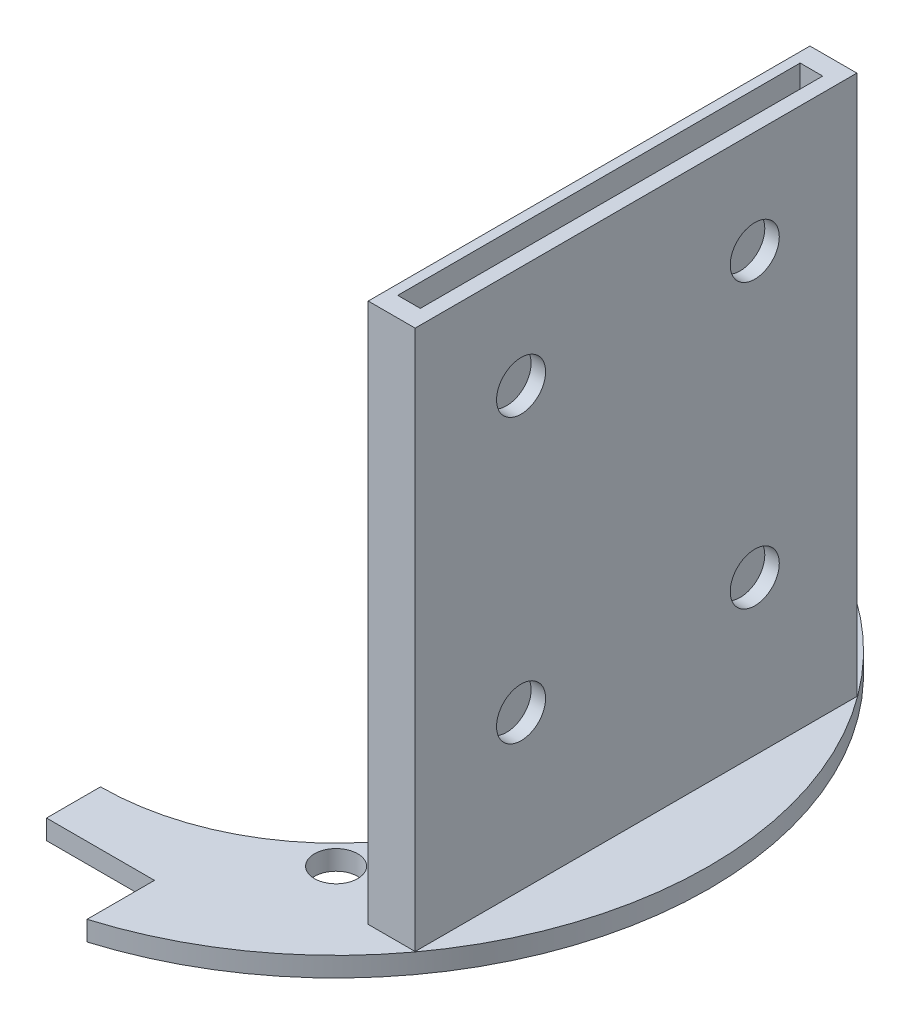
ISO-10303-21;
HEADER;
FILE_DESCRIPTION(('STEP AP214'),'2;1');
FILE_NAME('part.step','',(''),(''),'','','');
FILE_SCHEMA(('AUTOMOTIVE_DESIGN { 1 0 10303 214 1 1 1 1 }'));
ENDSEC;
DATA;
#1=APPLICATION_CONTEXT('core data for automotive mechanical design processes');
#2=APPLICATION_PROTOCOL_DEFINITION('international standard','automotive_design',2000,#1);
#3=PRODUCT_CONTEXT('',#1,'mechanical');
#4=PRODUCT('Part','Part','',(#3));
#5=PRODUCT_RELATED_PRODUCT_CATEGORY('part','',(#4));
#6=PRODUCT_DEFINITION_FORMATION('','',#4);
#7=PRODUCT_DEFINITION_CONTEXT('part definition',#1,'design');
#8=PRODUCT_DEFINITION('design','',#6,#7);
#9=PRODUCT_DEFINITION_SHAPE('','',#8);
#10=(LENGTH_UNIT() NAMED_UNIT(*) SI_UNIT(.MILLI.,.METRE.));
#11=(NAMED_UNIT(*) PLANE_ANGLE_UNIT() SI_UNIT($,.RADIAN.));
#12=(NAMED_UNIT(*) SI_UNIT($,.STERADIAN.) SOLID_ANGLE_UNIT());
#13=UNCERTAINTY_MEASURE_WITH_UNIT(LENGTH_MEASURE(1.E-05),#10,'distance_accuracy_value','');
#14=(GEOMETRIC_REPRESENTATION_CONTEXT(3) GLOBAL_UNCERTAINTY_ASSIGNED_CONTEXT((#13)) GLOBAL_UNIT_ASSIGNED_CONTEXT((#10,
#11,#12)) REPRESENTATION_CONTEXT('',''));
#15=CARTESIAN_POINT('',(0.,0.,0.));
#16=DIRECTION('',(0.,0.,1.));
#17=DIRECTION('',(1.,0.,0.));
#18=AXIS2_PLACEMENT_3D('',#15,#16,#17);
#19=CARTESIAN_POINT('',(3.,2.,0.));
#20=DIRECTION('',(0.,1.,0.));
#21=DIRECTION('',(0.,0.,1.));
#22=AXIS2_PLACEMENT_3D('',#19,#20,#21);
#23=PLANE('',#22);
#24=DIRECTION('',(0.,0.,-1.));
#25=VECTOR('',#24,1.);
#26=CARTESIAN_POINT('',(61.4999999999999,2.,-29.5));
#27=LINE('',#26,#25);
#28=CARTESIAN_POINT('',(61.4999999999999,2.,29.5));
#29=VERTEX_POINT('',#28);
#30=CARTESIAN_POINT('',(61.4999999999999,2.,24.));
#31=VERTEX_POINT('',#30);
#32=EDGE_CURVE('E234',#29,#31,#27,.T.);
#33=ORIENTED_EDGE('',*,*,#32,.F.);
#34=DIRECTION('',(-1.,0.,0.));
#35=VECTOR('',#34,1.);
#36=CARTESIAN_POINT('',(50.5,2.,29.5));
#37=LINE('',#36,#35);
#38=CARTESIAN_POINT('',(72.5,2.,29.5));
#39=VERTEX_POINT('',#38);
#40=EDGE_CURVE('E292',#39,#29,#37,.T.);
#41=ORIENTED_EDGE('',*,*,#40,.F.);
#42=DIRECTION('',(0.,0.,-1.));
#43=VECTOR('',#42,1.);
#44=CARTESIAN_POINT('',(72.5,2.,29.5));
#45=LINE('',#44,#43);
#46=CARTESIAN_POINT('',(72.5,2.,36.3730669589464));
#47=VERTEX_POINT('',#46);
#48=EDGE_CURVE('E255',#47,#39,#45,.T.);
#49=ORIENTED_EDGE('',*,*,#48,.F.);
#50=CARTESIAN_POINT('',(61.5,2.,0.));
#51=DIRECTION('',(0.,1.,0.));
#52=DIRECTION('',(0.,0.,1.));
#53=AXIS2_PLACEMENT_3D('',#50,#51,#52);
#54=CIRCLE('',#53,38.);
#55=CARTESIAN_POINT('',(72.5,2.,-36.3730669589464));
#56=VERTEX_POINT('',#55);
#57=EDGE_CURVE('E252',#47,#56,#54,.T.);
#58=ORIENTED_EDGE('',*,*,#57,.T.);
#59=DIRECTION('',(0.,0.,-1.));
#60=VECTOR('',#59,1.);
#61=CARTESIAN_POINT('',(72.5,2.,-38.));
#62=LINE('',#61,#60);
#63=CARTESIAN_POINT('',(72.5,2.,-29.5));
#64=VERTEX_POINT('',#63);
#65=EDGE_CURVE('E283',#64,#56,#62,.T.);
#66=ORIENTED_EDGE('',*,*,#65,.F.);
#67=DIRECTION('',(1.,0.,0.));
#68=VECTOR('',#67,1.);
#69=CARTESIAN_POINT('',(50.4999999999999,2.,-29.5));
#70=LINE('',#69,#68);
#71=CARTESIAN_POINT('',(61.4999999999999,2.,-29.5));
#72=VERTEX_POINT('',#71);
#73=EDGE_CURVE('E273',#72,#64,#70,.T.);
#74=ORIENTED_EDGE('',*,*,#73,.F.);
#75=CARTESIAN_POINT('',(61.4999999999999,2.,-24.));
#76=VERTEX_POINT('',#75);
#77=EDGE_CURVE('E232',#76,#72,#27,.T.);
#78=ORIENTED_EDGE('',*,*,#77,.F.);
#79=CARTESIAN_POINT('',(61.5,2.,0.));
#80=DIRECTION('',(0.,1.,0.));
#81=DIRECTION('',(0.,0.,1.));
#82=AXIS2_PLACEMENT_3D('',#79,#80,#81);
#83=CIRCLE('',#82,24.);
#84=EDGE_CURVE('E263',#31,#76,#83,.T.);
#85=ORIENTED_EDGE('',*,*,#84,.F.);
#86=EDGE_LOOP('',(#33,#41,#49,#58,#66,#74,#78,#85));
#87=FACE_BOUND('',#86,.T.);
#88=CARTESIAN_POINT('',(80.5,2.,-19.));
#89=DIRECTION('',(0.,1.,0.));
#90=DIRECTION('',(0.,0.,1.));
#91=AXIS2_PLACEMENT_3D('',#88,#89,#90);
#92=CIRCLE('',#91,2.2);
#93=CARTESIAN_POINT('',(80.5,2.,-16.8));
#94=VERTEX_POINT('',#93);
#95=EDGE_CURVE('E270',#94,#94,#92,.T.);
#96=ORIENTED_EDGE('',*,*,#95,.F.);
#97=EDGE_LOOP('',(#96));
#98=FACE_BOUND('',#97,.T.);
#99=CARTESIAN_POINT('',(80.5,2.,19.));
#100=DIRECTION('',(0.,1.,0.));
#101=DIRECTION('',(0.,0.,1.));
#102=AXIS2_PLACEMENT_3D('',#99,#100,#101);
#103=CIRCLE('',#102,2.2);
#104=CARTESIAN_POINT('',(80.5,2.,21.2));
#105=VERTEX_POINT('',#104);
#106=EDGE_CURVE('E266',#105,#105,#103,.T.);
#107=ORIENTED_EDGE('',*,*,#106,.F.);
#108=EDGE_LOOP('',(#107));
#109=FACE_BOUND('',#108,.T.);
#110=DIRECTION('',(1.,0.,0.));
#111=VECTOR('',#110,1.);
#112=CARTESIAN_POINT('',(0.,2.,22.5));
#113=LINE('',#112,#111);
#114=CARTESIAN_POINT('',(87.2756962609246,2.,22.5));
#115=VERTEX_POINT('',#114);
#116=CARTESIAN_POINT('',(92.0546502703319,2.,22.5));
#117=VERTEX_POINT('',#116);
#118=EDGE_CURVE('E219',#115,#117,#113,.T.);
#119=ORIENTED_EDGE('',*,*,#118,.F.);
#120=DIRECTION('',(0.,0.,1.));
#121=VECTOR('',#120,1.);
#122=CARTESIAN_POINT('',(87.2756962609246,2.,0.));
#123=LINE('',#122,#121);
#124=CARTESIAN_POINT('',(87.2756962609246,2.,-22.5));
#125=VERTEX_POINT('',#124);
#126=EDGE_CURVE('E201',#125,#115,#123,.T.);
#127=ORIENTED_EDGE('',*,*,#126,.F.);
#128=DIRECTION('',(-1.,0.,0.));
#129=VECTOR('',#128,1.);
#130=CARTESIAN_POINT('',(0.,2.,-22.5));
#131=LINE('',#130,#129);
#132=CARTESIAN_POINT('',(92.0546502703319,2.,-22.5));
#133=VERTEX_POINT('',#132);
#134=EDGE_CURVE('E209',#133,#125,#131,.T.);
#135=ORIENTED_EDGE('',*,*,#134,.F.);
#136=DIRECTION('',(0.,0.,1.));
#137=VECTOR('',#136,1.);
#138=CARTESIAN_POINT('',(92.0546502703319,2.,0.));
#139=LINE('',#138,#137);
#140=EDGE_CURVE('E74',#133,#117,#139,.T.);
#141=ORIENTED_EDGE('',*,*,#140,.T.);
#142=EDGE_LOOP('',(#119,#127,#135,#141));
#143=FACE_BOUND('',#142,.T.);
#144=ADVANCED_FACE('F49',(#87,#98,#109,#143),#23,.T.);
#145=CARTESIAN_POINT('',(80.5,0.,19.));
#146=DIRECTION('',(0.,1.,0.));
#147=DIRECTION('',(0.,0.,1.));
#148=AXIS2_PLACEMENT_3D('',#145,#146,#147);
#149=CYLINDRICAL_SURFACE('',#148,2.2);
#150=CARTESIAN_POINT('',(80.5,0.,19.));
#151=DIRECTION('',(0.,1.,0.));
#152=DIRECTION('',(0.,0.,1.));
#153=AXIS2_PLACEMENT_3D('',#150,#151,#152);
#154=CIRCLE('',#153,2.2);
#155=CARTESIAN_POINT('',(80.5,0.,21.2));
#156=VERTEX_POINT('',#155);
#157=EDGE_CURVE('E245',#156,#156,#154,.T.);
#158=ORIENTED_EDGE('',*,*,#157,.F.);
#159=EDGE_LOOP('',(#158));
#160=FACE_BOUND('',#159,.T.);
#161=ORIENTED_EDGE('',*,*,#106,.T.);
#162=EDGE_LOOP('',(#161));
#163=FACE_BOUND('',#162,.T.);
#164=ADVANCED_FACE('F359',(#160,#163),#149,.F.);
#165=CARTESIAN_POINT('',(80.5,0.,-19.));
#166=DIRECTION('',(0.,1.,0.));
#167=DIRECTION('',(0.,0.,1.));
#168=AXIS2_PLACEMENT_3D('',#165,#166,#167);
#169=CYLINDRICAL_SURFACE('',#168,2.2);
#170=CARTESIAN_POINT('',(80.5,0.,-19.));
#171=DIRECTION('',(0.,1.,0.));
#172=DIRECTION('',(0.,0.,1.));
#173=AXIS2_PLACEMENT_3D('',#170,#171,#172);
#174=CIRCLE('',#173,2.2);
#175=CARTESIAN_POINT('',(80.5,0.,-16.8));
#176=VERTEX_POINT('',#175);
#177=EDGE_CURVE('E262',#176,#176,#174,.T.);
#178=ORIENTED_EDGE('',*,*,#177,.F.);
#179=EDGE_LOOP('',(#178));
#180=FACE_BOUND('',#179,.T.);
#181=ORIENTED_EDGE('',*,*,#95,.T.);
#182=EDGE_LOOP('',(#181));
#183=FACE_BOUND('',#182,.T.);
#184=ADVANCED_FACE('F365',(#180,#183),#169,.F.);
#185=CARTESIAN_POINT('',(61.5,2.,0.));
#186=DIRECTION('',(0.,-1.,0.));
#187=DIRECTION('',(0.,0.,-1.));
#188=AXIS2_PLACEMENT_3D('',#185,#186,#187);
#189=CYLINDRICAL_SURFACE('',#188,38.);
#190=DIRECTION('',(0.,-1.,0.));
#191=VECTOR('',#190,1.);
#192=CARTESIAN_POINT('',(72.5,2.,36.3730669589464));
#193=LINE('',#192,#191);
#194=CARTESIAN_POINT('',(72.5,0.,36.3730669589464));
#195=VERTEX_POINT('',#194);
#196=EDGE_CURVE('E249',#47,#195,#193,.T.);
#197=ORIENTED_EDGE('',*,*,#196,.T.);
#198=CARTESIAN_POINT('',(61.5,0.,0.));
#199=DIRECTION('',(0.,1.,0.));
#200=DIRECTION('',(0.,0.,1.));
#201=AXIS2_PLACEMENT_3D('',#198,#199,#200);
#202=CIRCLE('',#201,38.);
#203=CARTESIAN_POINT('',(72.5,0.,-36.3730669589464));
#204=VERTEX_POINT('',#203);
#205=EDGE_CURVE('E246',#195,#204,#202,.T.);
#206=ORIENTED_EDGE('',*,*,#205,.T.);
#207=DIRECTION('',(0.,-1.,0.));
#208=VECTOR('',#207,1.);
#209=CARTESIAN_POINT('',(72.5,2.,-36.3730669589464));
#210=LINE('',#209,#208);
#211=EDGE_CURVE('E248',#204,#56,#210,.F.);
#212=ORIENTED_EDGE('',*,*,#211,.T.);
#213=ORIENTED_EDGE('',*,*,#57,.F.);
#214=EDGE_LOOP('',(#197,#206,#212,#213));
#215=FACE_BOUND('',#214,.T.);
#216=ADVANCED_FACE('F374',(#215),#189,.T.);
#217=CARTESIAN_POINT('',(72.5,0.,29.5));
#218=DIRECTION('',(1.,0.,0.));
#219=DIRECTION('',(0.,0.,-1.));
#220=AXIS2_PLACEMENT_3D('',#217,#218,#219);
#221=PLANE('',#220);
#222=ORIENTED_EDGE('',*,*,#48,.T.);
#223=DIRECTION('',(0.,1.,0.));
#224=VECTOR('',#223,1.);
#225=CARTESIAN_POINT('',(72.5,0.,29.5));
#226=LINE('',#225,#224);
#227=CARTESIAN_POINT('',(72.5,0.,29.5));
#228=VERTEX_POINT('',#227);
#229=EDGE_CURVE('E289',#228,#39,#226,.T.);
#230=ORIENTED_EDGE('',*,*,#229,.F.);
#231=DIRECTION('',(0.,0.,-1.));
#232=VECTOR('',#231,1.);
#233=CARTESIAN_POINT('',(72.5,0.,29.5));
#234=LINE('',#233,#232);
#235=EDGE_CURVE('E281',#195,#228,#234,.T.);
#236=ORIENTED_EDGE('',*,*,#235,.F.);
#237=ORIENTED_EDGE('',*,*,#196,.F.);
#238=EDGE_LOOP('',(#222,#230,#236,#237));
#239=FACE_BOUND('',#238,.T.);
#240=ADVANCED_FACE('F377',(#239),#221,.F.);
#241=CARTESIAN_POINT('',(72.5,0.,-38.));
#242=DIRECTION('',(1.,0.,0.));
#243=DIRECTION('',(0.,0.,-1.));
#244=AXIS2_PLACEMENT_3D('',#241,#242,#243);
#245=PLANE('',#244);
#246=DIRECTION('',(0.,0.,-1.));
#247=VECTOR('',#246,1.);
#248=CARTESIAN_POINT('',(72.5,0.,-38.));
#249=LINE('',#248,#247);
#250=CARTESIAN_POINT('',(72.5,0.,-29.5));
#251=VERTEX_POINT('',#250);
#252=EDGE_CURVE('E278',#251,#204,#249,.T.);
#253=ORIENTED_EDGE('',*,*,#252,.F.);
#254=DIRECTION('',(0.,1.,0.));
#255=VECTOR('',#254,1.);
#256=CARTESIAN_POINT('',(72.5,0.,-29.5));
#257=LINE('',#256,#255);
#258=EDGE_CURVE('E285',#251,#64,#257,.T.);
#259=ORIENTED_EDGE('',*,*,#258,.T.);
#260=ORIENTED_EDGE('',*,*,#65,.T.);
#261=ORIENTED_EDGE('',*,*,#211,.F.);
#262=EDGE_LOOP('',(#253,#259,#260,#261));
#263=FACE_BOUND('',#262,.T.);
#264=ADVANCED_FACE('F383',(#263),#245,.F.);
#265=CARTESIAN_POINT('',(61.5,2.,0.));
#266=DIRECTION('',(0.,-1.,0.));
#267=DIRECTION('',(0.,0.,-1.));
#268=AXIS2_PLACEMENT_3D('',#265,#266,#267);
#269=CYLINDRICAL_SURFACE('',#268,24.);
#270=DIRECTION('',(0.,-1.,0.));
#271=VECTOR('',#270,1.);
#272=CARTESIAN_POINT('',(61.4999999999999,2.,24.));
#273=LINE('',#272,#271);
#274=CARTESIAN_POINT('',(61.4999999999999,0.,24.));
#275=VERTEX_POINT('',#274);
#276=EDGE_CURVE('E12',#31,#275,#273,.T.);
#277=ORIENTED_EDGE('',*,*,#276,.F.);
#278=ORIENTED_EDGE('',*,*,#84,.T.);
#279=DIRECTION('',(0.,-1.,0.));
#280=VECTOR('',#279,1.);
#281=CARTESIAN_POINT('',(61.4999999999999,2.,-24.));
#282=LINE('',#281,#280);
#283=CARTESIAN_POINT('',(61.4999999999999,0.,-24.));
#284=VERTEX_POINT('',#283);
#285=EDGE_CURVE('E58',#284,#76,#282,.F.);
#286=ORIENTED_EDGE('',*,*,#285,.F.);
#287=CARTESIAN_POINT('',(61.5,0.,0.));
#288=DIRECTION('',(0.,1.,0.));
#289=DIRECTION('',(0.,0.,1.));
#290=AXIS2_PLACEMENT_3D('',#287,#288,#289);
#291=CIRCLE('',#290,24.);
#292=EDGE_CURVE('E259',#275,#284,#291,.T.);
#293=ORIENTED_EDGE('',*,*,#292,.F.);
#294=EDGE_LOOP('',(#277,#278,#286,#293));
#295=FACE_BOUND('',#294,.T.);
#296=ADVANCED_FACE('F379',(#295),#269,.F.);
#297=CARTESIAN_POINT('',(50.4999999999999,0.,-29.5));
#298=DIRECTION('',(0.,0.,1.));
#299=DIRECTION('',(1.,0.,0.));
#300=AXIS2_PLACEMENT_3D('',#297,#298,#299);
#301=PLANE('',#300);
#302=DIRECTION('',(1.,0.,0.));
#303=VECTOR('',#302,1.);
#304=CARTESIAN_POINT('',(50.4999999999999,0.,-29.5));
#305=LINE('',#304,#303);
#306=CARTESIAN_POINT('',(61.4999999999999,0.,-29.5));
#307=VERTEX_POINT('',#306);
#308=EDGE_CURVE('E269',#307,#251,#305,.T.);
#309=ORIENTED_EDGE('',*,*,#308,.F.);
#310=DIRECTION('',(0.,1.,0.));
#311=VECTOR('',#310,1.);
#312=CARTESIAN_POINT('',(61.4999999999999,0.,-29.5));
#313=LINE('',#312,#311);
#314=EDGE_CURVE('E238',#307,#72,#313,.T.);
#315=ORIENTED_EDGE('',*,*,#314,.T.);
#316=ORIENTED_EDGE('',*,*,#73,.T.);
#317=ORIENTED_EDGE('',*,*,#258,.F.);
#318=EDGE_LOOP('',(#309,#315,#316,#317));
#319=FACE_BOUND('',#318,.T.);
#320=ADVANCED_FACE('F382',(#319),#301,.F.);
#321=CARTESIAN_POINT('',(50.5,0.,29.5));
#322=DIRECTION('',(0.,0.,-1.));
#323=DIRECTION('',(-1.,0.,0.));
#324=AXIS2_PLACEMENT_3D('',#321,#322,#323);
#325=PLANE('',#324);
#326=ORIENTED_EDGE('',*,*,#40,.T.);
#327=DIRECTION('',(0.,-1.,0.));
#328=VECTOR('',#327,1.);
#329=CARTESIAN_POINT('',(61.4999999999999,0.,29.5));
#330=LINE('',#329,#328);
#331=CARTESIAN_POINT('',(61.4999999999999,0.,29.5));
#332=VERTEX_POINT('',#331);
#333=EDGE_CURVE('E242',#29,#332,#330,.T.);
#334=ORIENTED_EDGE('',*,*,#333,.T.);
#335=DIRECTION('',(-1.,0.,0.));
#336=VECTOR('',#335,1.);
#337=CARTESIAN_POINT('',(50.5,0.,29.5));
#338=LINE('',#337,#336);
#339=EDGE_CURVE('E258',#228,#332,#338,.T.);
#340=ORIENTED_EDGE('',*,*,#339,.F.);
#341=ORIENTED_EDGE('',*,*,#229,.T.);
#342=EDGE_LOOP('',(#326,#334,#340,#341));
#343=FACE_BOUND('',#342,.T.);
#344=ADVANCED_FACE('F51',(#343),#325,.F.);
#345=CARTESIAN_POINT('',(3.,0.,0.));
#346=DIRECTION('',(0.,1.,0.));
#347=DIRECTION('',(0.,0.,1.));
#348=AXIS2_PLACEMENT_3D('',#345,#346,#347);
#349=PLANE('',#348);
#350=ORIENTED_EDGE('',*,*,#177,.T.);
#351=EDGE_LOOP('',(#350));
#352=FACE_BOUND('',#351,.T.);
#353=ORIENTED_EDGE('',*,*,#339,.T.);
#354=DIRECTION('',(0.,0.,-1.));
#355=VECTOR('',#354,1.);
#356=CARTESIAN_POINT('',(61.4999999999999,0.,0.));
#357=LINE('',#356,#355);
#358=EDGE_CURVE('E239',#332,#275,#357,.T.);
#359=ORIENTED_EDGE('',*,*,#358,.T.);
#360=ORIENTED_EDGE('',*,*,#292,.T.);
#361=EDGE_CURVE('E235',#284,#307,#357,.T.);
#362=ORIENTED_EDGE('',*,*,#361,.T.);
#363=ORIENTED_EDGE('',*,*,#308,.T.);
#364=ORIENTED_EDGE('',*,*,#252,.T.);
#365=ORIENTED_EDGE('',*,*,#205,.F.);
#366=ORIENTED_EDGE('',*,*,#235,.T.);
#367=EDGE_LOOP('',(#353,#359,#360,#362,#363,#364,#365,#366));
#368=FACE_BOUND('',#367,.T.);
#369=ORIENTED_EDGE('',*,*,#157,.T.);
#370=EDGE_LOOP('',(#369));
#371=FACE_BOUND('',#370,.T.);
#372=ADVANCED_FACE('F372',(#352,#368,#371),#349,.F.);
#373=CARTESIAN_POINT('',(61.4999999999999,-1.,-29.5));
#374=DIRECTION('',(1.,0.,0.));
#375=DIRECTION('',(0.,0.,-1.));
#376=AXIS2_PLACEMENT_3D('',#373,#374,#375);
#377=PLANE('',#376);
#378=ORIENTED_EDGE('',*,*,#361,.F.);
#379=ORIENTED_EDGE('',*,*,#285,.T.);
#380=ORIENTED_EDGE('',*,*,#77,.T.);
#381=ORIENTED_EDGE('',*,*,#314,.F.);
#382=EDGE_LOOP('',(#378,#379,#380,#381));
#383=FACE_BOUND('',#382,.T.);
#384=ADVANCED_FACE('F421',(#383),#377,.F.);
#385=ORIENTED_EDGE('',*,*,#32,.T.);
#386=ORIENTED_EDGE('',*,*,#276,.T.);
#387=ORIENTED_EDGE('',*,*,#358,.F.);
#388=ORIENTED_EDGE('',*,*,#333,.F.);
#389=EDGE_LOOP('',(#385,#386,#387,#388));
#390=FACE_BOUND('',#389,.T.);
#391=ADVANCED_FACE('F408',(#390),#377,.F.);
#392=CARTESIAN_POINT('',(87.2756962609246,57.,0.));
#393=DIRECTION('',(1.,0.,0.));
#394=DIRECTION('',(0.,0.,-1.));
#395=AXIS2_PLACEMENT_3D('',#392,#393,#394);
#396=PLANE('',#395);
#397=CARTESIAN_POINT('',(87.2756962609246,46.5146400205178,11.7084915272428));
#398=DIRECTION('',(-1.,0.,0.));
#399=DIRECTION('',(0.,0.,1.));
#400=AXIS2_PLACEMENT_3D('',#397,#398,#399);
#401=CIRCLE('',#400,2.5);
#402=CARTESIAN_POINT('',(87.2756962609246,46.5146400205178,14.2084915272428));
#403=VERTEX_POINT('',#402);
#404=EDGE_CURVE('E499',#403,#403,#401,.T.);
#405=ORIENTED_EDGE('',*,*,#404,.F.);
#406=EDGE_LOOP('',(#405));
#407=FACE_BOUND('',#406,.T.);
#408=CARTESIAN_POINT('',(87.2756962609246,17.7004789930939,-12.0981316557697));
#409=DIRECTION('',(-1.,0.,0.));
#410=DIRECTION('',(0.,0.,1.));
#411=AXIS2_PLACEMENT_3D('',#408,#409,#410);
#412=CIRCLE('',#411,2.5);
#413=CARTESIAN_POINT('',(87.2756962609246,17.7004789930939,-9.59813165576973));
#414=VERTEX_POINT('',#413);
#415=EDGE_CURVE('E470',#414,#414,#412,.T.);
#416=ORIENTED_EDGE('',*,*,#415,.F.);
#417=EDGE_LOOP('',(#416));
#418=FACE_BOUND('',#417,.T.);
#419=CARTESIAN_POINT('',(87.2756962609246,17.7004789930939,11.7084915272428));
#420=DIRECTION('',(-1.,0.,0.));
#421=DIRECTION('',(0.,0.,1.));
#422=AXIS2_PLACEMENT_3D('',#419,#420,#421);
#423=CIRCLE('',#422,2.5);
#424=CARTESIAN_POINT('',(87.2756962609246,17.7004789930939,14.2084915272428));
#425=VERTEX_POINT('',#424);
#426=EDGE_CURVE('E501',#425,#425,#423,.T.);
#427=ORIENTED_EDGE('',*,*,#426,.F.);
#428=EDGE_LOOP('',(#427));
#429=FACE_BOUND('',#428,.T.);
#430=CARTESIAN_POINT('',(87.2756962609246,46.5146400205178,-12.0981316557697));
#431=DIRECTION('',(-1.,0.,0.));
#432=DIRECTION('',(0.,0.,1.));
#433=AXIS2_PLACEMENT_3D('',#430,#431,#432);
#434=CIRCLE('',#433,2.5);
#435=CARTESIAN_POINT('',(87.2756962609246,46.5146400205178,-9.59813165576973));
#436=VERTEX_POINT('',#435);
#437=EDGE_CURVE('E304',#436,#436,#434,.T.);
#438=ORIENTED_EDGE('',*,*,#437,.F.);
#439=EDGE_LOOP('',(#438));
#440=FACE_BOUND('',#439,.T.);
#441=ORIENTED_EDGE('',*,*,#126,.T.);
#442=DIRECTION('',(0.,-1.,0.));
#443=VECTOR('',#442,1.);
#444=CARTESIAN_POINT('',(87.2756962609246,57.,22.5));
#445=LINE('',#444,#443);
#446=CARTESIAN_POINT('',(87.2756962609246,57.,22.5));
#447=VERTEX_POINT('',#446);
#448=EDGE_CURVE('E230',#447,#115,#445,.T.);
#449=ORIENTED_EDGE('',*,*,#448,.F.);
#450=DIRECTION('',(0.,0.,1.));
#451=VECTOR('',#450,1.);
#452=CARTESIAN_POINT('',(87.2756962609246,57.,0.));
#453=LINE('',#452,#451);
#454=CARTESIAN_POINT('',(87.2756962609246,57.,-22.5));
#455=VERTEX_POINT('',#454);
#456=EDGE_CURVE('E205',#455,#447,#453,.T.);
#457=ORIENTED_EDGE('',*,*,#456,.F.);
#458=DIRECTION('',(0.,-1.,0.));
#459=VECTOR('',#458,1.);
#460=CARTESIAN_POINT('',(87.2756962609246,57.,-22.5));
#461=LINE('',#460,#459);
#462=EDGE_CURVE('E216',#455,#125,#461,.T.);
#463=ORIENTED_EDGE('',*,*,#462,.T.);
#464=EDGE_LOOP('',(#441,#449,#457,#463));
#465=FACE_BOUND('',#464,.T.);
#466=ADVANCED_FACE('F427',(#407,#418,#429,#440,#465),#396,.F.);
#467=CARTESIAN_POINT('',(0.,57.,22.5));
#468=DIRECTION('',(0.,0.,-1.));
#469=DIRECTION('',(-1.,0.,0.));
#470=AXIS2_PLACEMENT_3D('',#467,#468,#469);
#471=PLANE('',#470);
#472=ORIENTED_EDGE('',*,*,#118,.T.);
#473=DIRECTION('',(0.,-1.,0.));
#474=VECTOR('',#473,1.);
#475=CARTESIAN_POINT('',(92.0546502703319,57.,22.5));
#476=LINE('',#475,#474);
#477=CARTESIAN_POINT('',(92.0546502703319,57.,22.5));
#478=VERTEX_POINT('',#477);
#479=EDGE_CURVE('E228',#478,#117,#476,.T.);
#480=ORIENTED_EDGE('',*,*,#479,.F.);
#481=DIRECTION('',(1.,0.,0.));
#482=VECTOR('',#481,1.);
#483=CARTESIAN_POINT('',(0.,57.,22.5));
#484=LINE('',#483,#482);
#485=EDGE_CURVE('E208',#447,#478,#484,.T.);
#486=ORIENTED_EDGE('',*,*,#485,.F.);
#487=ORIENTED_EDGE('',*,*,#448,.T.);
#488=EDGE_LOOP('',(#472,#480,#486,#487));
#489=FACE_BOUND('',#488,.T.);
#490=ADVANCED_FACE('F432',(#489),#471,.F.);
#491=CARTESIAN_POINT('',(92.0546502703319,57.,0.));
#492=DIRECTION('',(1.,0.,0.));
#493=DIRECTION('',(0.,0.,-1.));
#494=AXIS2_PLACEMENT_3D('',#491,#492,#493);
#495=PLANE('',#494);
#496=CARTESIAN_POINT('',(92.0546502703319,46.5146400205178,11.7084915272428));
#497=DIRECTION('',(1.,0.,0.));
#498=DIRECTION('',(0.,0.,-1.));
#499=AXIS2_PLACEMENT_3D('',#496,#497,#498);
#500=CIRCLE('',#499,2.5);
#501=CARTESIAN_POINT('',(92.0546502703319,46.5146400205178,9.20849152724283));
#502=VERTEX_POINT('',#501);
#503=EDGE_CURVE('E189',#502,#502,#500,.T.);
#504=ORIENTED_EDGE('',*,*,#503,.F.);
#505=EDGE_LOOP('',(#504));
#506=FACE_BOUND('',#505,.T.);
#507=CARTESIAN_POINT('',(92.0546502703319,17.7004789930939,-12.0981316557697));
#508=DIRECTION('',(1.,0.,0.));
#509=DIRECTION('',(0.,0.,-1.));
#510=AXIS2_PLACEMENT_3D('',#507,#508,#509);
#511=CIRCLE('',#510,2.5);
#512=CARTESIAN_POINT('',(92.0546502703319,17.7004789930939,-14.5981316557697));
#513=VERTEX_POINT('',#512);
#514=EDGE_CURVE('E316',#513,#513,#511,.T.);
#515=ORIENTED_EDGE('',*,*,#514,.F.);
#516=EDGE_LOOP('',(#515));
#517=FACE_BOUND('',#516,.T.);
#518=CARTESIAN_POINT('',(92.0546502703319,17.7004789930939,11.7084915272428));
#519=DIRECTION('',(1.,0.,0.));
#520=DIRECTION('',(0.,0.,-1.));
#521=AXIS2_PLACEMENT_3D('',#518,#519,#520);
#522=CIRCLE('',#521,2.5);
#523=CARTESIAN_POINT('',(92.0546502703319,17.7004789930939,9.20849152724283));
#524=VERTEX_POINT('',#523);
#525=EDGE_CURVE('E312',#524,#524,#522,.T.);
#526=ORIENTED_EDGE('',*,*,#525,.F.);
#527=EDGE_LOOP('',(#526));
#528=FACE_BOUND('',#527,.T.);
#529=CARTESIAN_POINT('',(92.0546502703319,46.5146400205178,-12.0981316557697));
#530=DIRECTION('',(1.,0.,0.));
#531=DIRECTION('',(0.,0.,-1.));
#532=AXIS2_PLACEMENT_3D('',#529,#530,#531);
#533=CIRCLE('',#532,2.5);
#534=CARTESIAN_POINT('',(92.0546502703319,46.5146400205178,-14.5981316557697));
#535=VERTEX_POINT('',#534);
#536=EDGE_CURVE('E308',#535,#535,#533,.T.);
#537=ORIENTED_EDGE('',*,*,#536,.F.);
#538=EDGE_LOOP('',(#537));
#539=FACE_BOUND('',#538,.T.);
#540=ORIENTED_EDGE('',*,*,#140,.F.);
#541=DIRECTION('',(0.,-1.,0.));
#542=VECTOR('',#541,1.);
#543=CARTESIAN_POINT('',(92.0546502703319,57.,-22.5));
#544=LINE('',#543,#542);
#545=CARTESIAN_POINT('',(92.0546502703319,57.,-22.5));
#546=VERTEX_POINT('',#545);
#547=EDGE_CURVE('E226',#546,#133,#544,.T.);
#548=ORIENTED_EDGE('',*,*,#547,.F.);
#549=DIRECTION('',(0.,0.,1.));
#550=VECTOR('',#549,1.);
#551=CARTESIAN_POINT('',(92.0546502703319,57.,0.));
#552=LINE('',#551,#550);
#553=EDGE_CURVE('E211',#546,#478,#552,.T.);
#554=ORIENTED_EDGE('',*,*,#553,.T.);
#555=ORIENTED_EDGE('',*,*,#479,.T.);
#556=EDGE_LOOP('',(#540,#548,#554,#555));
#557=FACE_BOUND('',#556,.T.);
#558=ADVANCED_FACE('F436',(#506,#517,#528,#539,#557),#495,.T.);
#559=CARTESIAN_POINT('',(0.,57.,-22.5));
#560=DIRECTION('',(0.,0.,1.));
#561=DIRECTION('',(1.,0.,0.));
#562=AXIS2_PLACEMENT_3D('',#559,#560,#561);
#563=PLANE('',#562);
#564=ORIENTED_EDGE('',*,*,#134,.T.);
#565=ORIENTED_EDGE('',*,*,#462,.F.);
#566=DIRECTION('',(-1.,0.,0.));
#567=VECTOR('',#566,1.);
#568=CARTESIAN_POINT('',(0.,57.,-22.5));
#569=LINE('',#568,#567);
#570=EDGE_CURVE('E214',#546,#455,#569,.T.);
#571=ORIENTED_EDGE('',*,*,#570,.F.);
#572=ORIENTED_EDGE('',*,*,#547,.T.);
#573=EDGE_LOOP('',(#564,#565,#571,#572));
#574=FACE_BOUND('',#573,.T.);
#575=ADVANCED_FACE('F440',(#574),#563,.F.);
#576=CARTESIAN_POINT('',(0.,57.,0.));
#577=DIRECTION('',(0.,1.,0.));
#578=DIRECTION('',(0.,0.,1.));
#579=AXIS2_PLACEMENT_3D('',#576,#577,#578);
#580=PLANE('',#579);
#581=DIRECTION('',(1.,0.,0.));
#582=VECTOR('',#581,1.);
#583=CARTESIAN_POINT('',(90.578943901189,57.,20.4981316557697));
#584=LINE('',#583,#582);
#585=CARTESIAN_POINT('',(88.2773992942253,57.,20.4981316557697));
#586=VERTEX_POINT('',#585);
#587=CARTESIAN_POINT('',(90.578943901189,57.,20.4981316557697));
#588=VERTEX_POINT('',#587);
#589=EDGE_CURVE('E66',#586,#588,#584,.T.);
#590=ORIENTED_EDGE('',*,*,#589,.F.);
#591=DIRECTION('',(0.,0.,1.));
#592=VECTOR('',#591,1.);
#593=CARTESIAN_POINT('',(88.2773992942253,57.,-20.4981316557697));
#594=LINE('',#593,#592);
#595=CARTESIAN_POINT('',(88.2773992942253,57.,-20.4981316557697));
#596=VERTEX_POINT('',#595);
#597=EDGE_CURVE('E183',#596,#586,#594,.T.);
#598=ORIENTED_EDGE('',*,*,#597,.F.);
#599=DIRECTION('',(-1.,0.,0.));
#600=VECTOR('',#599,1.);
#601=CARTESIAN_POINT('',(88.2773992942253,57.,-20.4981316557697));
#602=LINE('',#601,#600);
#603=CARTESIAN_POINT('',(90.578943901189,57.,-20.4981316557697));
#604=VERTEX_POINT('',#603);
#605=EDGE_CURVE('E186',#604,#596,#602,.T.);
#606=ORIENTED_EDGE('',*,*,#605,.F.);
#607=DIRECTION('',(0.,0.,-1.));
#608=VECTOR('',#607,1.);
#609=CARTESIAN_POINT('',(90.578943901189,57.,-20.4981316557697));
#610=LINE('',#609,#608);
#611=EDGE_CURVE('E195',#588,#604,#610,.T.);
#612=ORIENTED_EDGE('',*,*,#611,.F.);
#613=EDGE_LOOP('',(#590,#598,#606,#612));
#614=FACE_BOUND('',#613,.T.);
#615=ORIENTED_EDGE('',*,*,#456,.T.);
#616=ORIENTED_EDGE('',*,*,#485,.T.);
#617=ORIENTED_EDGE('',*,*,#553,.F.);
#618=ORIENTED_EDGE('',*,*,#570,.T.);
#619=EDGE_LOOP('',(#615,#616,#617,#618));
#620=FACE_BOUND('',#619,.T.);
#621=ADVANCED_FACE('F444',(#614,#620),#580,.T.);
#622=CARTESIAN_POINT('',(90.578943901189,10.,20.4981316557697));
#623=DIRECTION('',(0.,0.,1.));
#624=DIRECTION('',(1.,0.,0.));
#625=AXIS2_PLACEMENT_3D('',#622,#623,#624);
#626=PLANE('',#625);
#627=ORIENTED_EDGE('',*,*,#589,.T.);
#628=DIRECTION('',(0.,1.,0.));
#629=VECTOR('',#628,1.);
#630=CARTESIAN_POINT('',(90.578943901189,10.,20.4981316557697));
#631=LINE('',#630,#629);
#632=CARTESIAN_POINT('',(90.578943901189,10.,20.4981316557697));
#633=VERTEX_POINT('',#632);
#634=EDGE_CURVE('E161',#633,#588,#631,.T.);
#635=ORIENTED_EDGE('',*,*,#634,.F.);
#636=DIRECTION('',(1.,0.,0.));
#637=VECTOR('',#636,1.);
#638=CARTESIAN_POINT('',(90.578943901189,10.,20.4981316557697));
#639=LINE('',#638,#637);
#640=CARTESIAN_POINT('',(88.2773992942253,10.,20.4981316557697));
#641=VERTEX_POINT('',#640);
#642=EDGE_CURVE('E165',#641,#633,#639,.T.);
#643=ORIENTED_EDGE('',*,*,#642,.F.);
#644=DIRECTION('',(0.,1.,0.));
#645=VECTOR('',#644,1.);
#646=CARTESIAN_POINT('',(88.2773992942253,10.,20.4981316557697));
#647=LINE('',#646,#645);
#648=EDGE_CURVE('E199',#641,#586,#647,.T.);
#649=ORIENTED_EDGE('',*,*,#648,.T.);
#650=EDGE_LOOP('',(#627,#635,#643,#649));
#651=FACE_BOUND('',#650,.T.);
#652=ADVANCED_FACE('F163',(#651),#626,.F.);
#653=CARTESIAN_POINT('',(88.2773992942253,10.,-20.4981316557697));
#654=DIRECTION('',(-1.,0.,0.));
#655=DIRECTION('',(0.,0.,1.));
#656=AXIS2_PLACEMENT_3D('',#653,#654,#655);
#657=PLANE('',#656);
#658=CARTESIAN_POINT('',(88.2773992942253,46.5146400205178,11.7084915272428));
#659=DIRECTION('',(-1.,0.,0.));
#660=DIRECTION('',(0.,0.,1.));
#661=AXIS2_PLACEMENT_3D('',#658,#659,#660);
#662=CIRCLE('',#661,2.5);
#663=CARTESIAN_POINT('',(88.2773992942253,46.5146400205178,14.2084915272428));
#664=VERTEX_POINT('',#663);
#665=EDGE_CURVE('E327',#664,#664,#662,.T.);
#666=ORIENTED_EDGE('',*,*,#665,.T.);
#667=EDGE_LOOP('',(#666));
#668=FACE_BOUND('',#667,.T.);
#669=CARTESIAN_POINT('',(88.2773992942253,17.7004789930939,-12.0981316557697));
#670=DIRECTION('',(-1.,0.,0.));
#671=DIRECTION('',(0.,0.,1.));
#672=AXIS2_PLACEMENT_3D('',#669,#670,#671);
#673=CIRCLE('',#672,2.5);
#674=CARTESIAN_POINT('',(88.2773992942253,17.7004789930939,-9.59813165576973));
#675=VERTEX_POINT('',#674);
#676=EDGE_CURVE('E311',#675,#675,#673,.T.);
#677=ORIENTED_EDGE('',*,*,#676,.T.);
#678=EDGE_LOOP('',(#677));
#679=FACE_BOUND('',#678,.T.);
#680=CARTESIAN_POINT('',(88.2773992942253,17.7004789930939,11.7084915272428));
#681=DIRECTION('',(-1.,0.,0.));
#682=DIRECTION('',(0.,0.,1.));
#683=AXIS2_PLACEMENT_3D('',#680,#681,#682);
#684=CIRCLE('',#683,2.5);
#685=CARTESIAN_POINT('',(88.2773992942253,17.7004789930939,14.2084915272428));
#686=VERTEX_POINT('',#685);
#687=EDGE_CURVE('E307',#686,#686,#684,.T.);
#688=ORIENTED_EDGE('',*,*,#687,.T.);
#689=EDGE_LOOP('',(#688));
#690=FACE_BOUND('',#689,.T.);
#691=CARTESIAN_POINT('',(88.2773992942253,46.5146400205178,-12.0981316557697));
#692=DIRECTION('',(-1.,0.,0.));
#693=DIRECTION('',(0.,0.,1.));
#694=AXIS2_PLACEMENT_3D('',#691,#692,#693);
#695=CIRCLE('',#694,2.5);
#696=CARTESIAN_POINT('',(88.2773992942253,46.5146400205178,-9.59813165576973));
#697=VERTEX_POINT('',#696);
#698=EDGE_CURVE('E303',#697,#697,#695,.T.);
#699=ORIENTED_EDGE('',*,*,#698,.T.);
#700=EDGE_LOOP('',(#699));
#701=FACE_BOUND('',#700,.T.);
#702=ORIENTED_EDGE('',*,*,#597,.T.);
#703=ORIENTED_EDGE('',*,*,#648,.F.);
#704=DIRECTION('',(0.,0.,1.));
#705=VECTOR('',#704,1.);
#706=CARTESIAN_POINT('',(88.2773992942253,10.,-20.4981316557697));
#707=LINE('',#706,#705);
#708=CARTESIAN_POINT('',(88.2773992942253,10.,-20.4981316557697));
#709=VERTEX_POINT('',#708);
#710=EDGE_CURVE('E171',#709,#641,#707,.T.);
#711=ORIENTED_EDGE('',*,*,#710,.F.);
#712=DIRECTION('',(0.,1.,0.));
#713=VECTOR('',#712,1.);
#714=CARTESIAN_POINT('',(88.2773992942253,10.,-20.4981316557697));
#715=LINE('',#714,#713);
#716=EDGE_CURVE('E202',#709,#596,#715,.T.);
#717=ORIENTED_EDGE('',*,*,#716,.T.);
#718=EDGE_LOOP('',(#702,#703,#711,#717));
#719=FACE_BOUND('',#718,.T.);
#720=ADVANCED_FACE('F451',(#668,#679,#690,#701,#719),#657,.F.);
#721=CARTESIAN_POINT('',(88.2773992942253,10.,-20.4981316557697));
#722=DIRECTION('',(0.,0.,-1.));
#723=DIRECTION('',(-1.,0.,0.));
#724=AXIS2_PLACEMENT_3D('',#721,#722,#723);
#725=PLANE('',#724);
#726=ORIENTED_EDGE('',*,*,#605,.T.);
#727=ORIENTED_EDGE('',*,*,#716,.F.);
#728=DIRECTION('',(-1.,0.,0.));
#729=VECTOR('',#728,1.);
#730=CARTESIAN_POINT('',(88.2773992942253,10.,-20.4981316557697));
#731=LINE('',#730,#729);
#732=CARTESIAN_POINT('',(90.578943901189,10.,-20.4981316557697));
#733=VERTEX_POINT('',#732);
#734=EDGE_CURVE('E179',#733,#709,#731,.T.);
#735=ORIENTED_EDGE('',*,*,#734,.F.);
#736=DIRECTION('',(0.,1.,0.));
#737=VECTOR('',#736,1.);
#738=CARTESIAN_POINT('',(90.578943901189,10.,-20.4981316557697));
#739=LINE('',#738,#737);
#740=EDGE_CURVE('E170',#733,#604,#739,.T.);
#741=ORIENTED_EDGE('',*,*,#740,.T.);
#742=EDGE_LOOP('',(#726,#727,#735,#741));
#743=FACE_BOUND('',#742,.T.);
#744=ADVANCED_FACE('F454',(#743),#725,.F.);
#745=CARTESIAN_POINT('',(90.578943901189,10.,-20.4981316557697));
#746=DIRECTION('',(1.,0.,0.));
#747=DIRECTION('',(0.,0.,-1.));
#748=AXIS2_PLACEMENT_3D('',#745,#746,#747);
#749=PLANE('',#748);
#750=CARTESIAN_POINT('',(90.578943901189,46.5146400205178,11.7084915272428));
#751=DIRECTION('',(1.,0.,0.));
#752=DIRECTION('',(0.,0.,-1.));
#753=AXIS2_PLACEMENT_3D('',#750,#751,#752);
#754=CIRCLE('',#753,2.5);
#755=CARTESIAN_POINT('',(90.578943901189,46.5146400205178,9.20849152724283));
#756=VERTEX_POINT('',#755);
#757=EDGE_CURVE('E53',#756,#756,#754,.T.);
#758=ORIENTED_EDGE('',*,*,#757,.T.);
#759=EDGE_LOOP('',(#758));
#760=FACE_BOUND('',#759,.T.);
#761=CARTESIAN_POINT('',(90.578943901189,17.7004789930939,-12.0981316557697));
#762=DIRECTION('',(1.,0.,0.));
#763=DIRECTION('',(0.,0.,-1.));
#764=AXIS2_PLACEMENT_3D('',#761,#762,#763);
#765=CIRCLE('',#764,2.5);
#766=CARTESIAN_POINT('',(90.578943901189,17.7004789930939,-14.5981316557697));
#767=VERTEX_POINT('',#766);
#768=EDGE_CURVE('E309',#767,#767,#765,.T.);
#769=ORIENTED_EDGE('',*,*,#768,.T.);
#770=EDGE_LOOP('',(#769));
#771=FACE_BOUND('',#770,.T.);
#772=CARTESIAN_POINT('',(90.578943901189,17.7004789930939,11.7084915272428));
#773=DIRECTION('',(1.,0.,0.));
#774=DIRECTION('',(0.,0.,-1.));
#775=AXIS2_PLACEMENT_3D('',#772,#773,#774);
#776=CIRCLE('',#775,2.5);
#777=CARTESIAN_POINT('',(90.578943901189,17.7004789930939,9.20849152724283));
#778=VERTEX_POINT('',#777);
#779=EDGE_CURVE('E305',#778,#778,#776,.T.);
#780=ORIENTED_EDGE('',*,*,#779,.T.);
#781=EDGE_LOOP('',(#780));
#782=FACE_BOUND('',#781,.T.);
#783=CARTESIAN_POINT('',(90.578943901189,46.5146400205178,-12.0981316557697));
#784=DIRECTION('',(1.,0.,0.));
#785=DIRECTION('',(0.,0.,-1.));
#786=AXIS2_PLACEMENT_3D('',#783,#784,#785);
#787=CIRCLE('',#786,2.5);
#788=CARTESIAN_POINT('',(90.578943901189,46.5146400205178,-14.5981316557697));
#789=VERTEX_POINT('',#788);
#790=EDGE_CURVE('E300',#789,#789,#787,.T.);
#791=ORIENTED_EDGE('',*,*,#790,.T.);
#792=EDGE_LOOP('',(#791));
#793=FACE_BOUND('',#792,.T.);
#794=ORIENTED_EDGE('',*,*,#611,.T.);
#795=ORIENTED_EDGE('',*,*,#740,.F.);
#796=DIRECTION('',(0.,0.,-1.));
#797=VECTOR('',#796,1.);
#798=CARTESIAN_POINT('',(90.578943901189,10.,-20.4981316557697));
#799=LINE('',#798,#797);
#800=EDGE_CURVE('E174',#633,#733,#799,.T.);
#801=ORIENTED_EDGE('',*,*,#800,.F.);
#802=ORIENTED_EDGE('',*,*,#634,.T.);
#803=EDGE_LOOP('',(#794,#795,#801,#802));
#804=FACE_BOUND('',#803,.T.);
#805=ADVANCED_FACE('F175',(#760,#771,#782,#793,#804),#749,.F.);
#806=CARTESIAN_POINT('',(0.,10.,0.));
#807=DIRECTION('',(0.,1.,0.));
#808=DIRECTION('',(0.,0.,1.));
#809=AXIS2_PLACEMENT_3D('',#806,#807,#808);
#810=PLANE('',#809);
#811=ORIENTED_EDGE('',*,*,#642,.T.);
#812=ORIENTED_EDGE('',*,*,#800,.T.);
#813=ORIENTED_EDGE('',*,*,#734,.T.);
#814=ORIENTED_EDGE('',*,*,#710,.T.);
#815=EDGE_LOOP('',(#811,#812,#813,#814));
#816=FACE_BOUND('',#815,.T.);
#817=ADVANCED_FACE('F181',(#816),#810,.T.);
#818=CARTESIAN_POINT('',(99.5,46.5146400205178,-12.0981316557697));
#819=DIRECTION('',(-1.,0.,0.));
#820=DIRECTION('',(0.,0.,1.));
#821=AXIS2_PLACEMENT_3D('',#818,#819,#820);
#822=CYLINDRICAL_SURFACE('',#821,2.5);
#823=ORIENTED_EDGE('',*,*,#536,.T.);
#824=EDGE_LOOP('',(#823));
#825=FACE_BOUND('',#824,.T.);
#826=ORIENTED_EDGE('',*,*,#790,.F.);
#827=EDGE_LOOP('',(#826));
#828=FACE_BOUND('',#827,.T.);
#829=ADVANCED_FACE('F350',(#825,#828),#822,.F.);
#830=CARTESIAN_POINT('',(99.5,17.7004789930939,11.7084915272428));
#831=DIRECTION('',(-1.,0.,0.));
#832=DIRECTION('',(0.,0.,1.));
#833=AXIS2_PLACEMENT_3D('',#830,#831,#832);
#834=CYLINDRICAL_SURFACE('',#833,2.5);
#835=ORIENTED_EDGE('',*,*,#525,.T.);
#836=EDGE_LOOP('',(#835));
#837=FACE_BOUND('',#836,.T.);
#838=ORIENTED_EDGE('',*,*,#779,.F.);
#839=EDGE_LOOP('',(#838));
#840=FACE_BOUND('',#839,.T.);
#841=ADVANCED_FACE('F351',(#837,#840),#834,.F.);
#842=CARTESIAN_POINT('',(99.5,17.7004789930939,-12.0981316557697));
#843=DIRECTION('',(-1.,0.,0.));
#844=DIRECTION('',(0.,0.,1.));
#845=AXIS2_PLACEMENT_3D('',#842,#843,#844);
#846=CYLINDRICAL_SURFACE('',#845,2.5);
#847=ORIENTED_EDGE('',*,*,#514,.T.);
#848=EDGE_LOOP('',(#847));
#849=FACE_BOUND('',#848,.T.);
#850=ORIENTED_EDGE('',*,*,#768,.F.);
#851=EDGE_LOOP('',(#850));
#852=FACE_BOUND('',#851,.T.);
#853=ADVANCED_FACE('F339',(#849,#852),#846,.F.);
#854=CARTESIAN_POINT('',(99.5,46.5146400205178,11.7084915272428));
#855=DIRECTION('',(-1.,0.,0.));
#856=DIRECTION('',(0.,0.,1.));
#857=AXIS2_PLACEMENT_3D('',#854,#855,#856);
#858=CYLINDRICAL_SURFACE('',#857,2.5);
#859=ORIENTED_EDGE('',*,*,#503,.T.);
#860=EDGE_LOOP('',(#859));
#861=FACE_BOUND('',#860,.T.);
#862=ORIENTED_EDGE('',*,*,#757,.F.);
#863=EDGE_LOOP('',(#862));
#864=FACE_BOUND('',#863,.T.);
#865=ADVANCED_FACE('F336',(#861,#864),#858,.F.);
#866=ORIENTED_EDGE('',*,*,#437,.T.);
#867=EDGE_LOOP('',(#866));
#868=FACE_BOUND('',#867,.T.);
#869=ORIENTED_EDGE('',*,*,#698,.F.);
#870=EDGE_LOOP('',(#869));
#871=FACE_BOUND('',#870,.T.);
#872=ADVANCED_FACE('F338',(#868,#871),#822,.F.);
#873=ORIENTED_EDGE('',*,*,#426,.T.);
#874=EDGE_LOOP('',(#873));
#875=FACE_BOUND('',#874,.T.);
#876=ORIENTED_EDGE('',*,*,#687,.F.);
#877=EDGE_LOOP('',(#876));
#878=FACE_BOUND('',#877,.T.);
#879=ADVANCED_FACE('F347',(#875,#878),#834,.F.);
#880=ORIENTED_EDGE('',*,*,#415,.T.);
#881=EDGE_LOOP('',(#880));
#882=FACE_BOUND('',#881,.T.);
#883=ORIENTED_EDGE('',*,*,#676,.F.);
#884=EDGE_LOOP('',(#883));
#885=FACE_BOUND('',#884,.T.);
#886=ADVANCED_FACE('F354',(#882,#885),#846,.F.);
#887=ORIENTED_EDGE('',*,*,#404,.T.);
#888=EDGE_LOOP('',(#887));
#889=FACE_BOUND('',#888,.T.);
#890=ORIENTED_EDGE('',*,*,#665,.F.);
#891=EDGE_LOOP('',(#890));
#892=FACE_BOUND('',#891,.T.);
#893=ADVANCED_FACE('F342',(#889,#892),#858,.F.);
#894=CLOSED_SHELL('',(#144,#164,#184,#216,#240,#264,#296,#320,#344,#372,#384,#391,#466,#490,
#558,#575,#621,#652,#720,#744,#805,#817,#829,#841,#853,#865,#872,#879,#886,#893));
#895=MANIFOLD_SOLID_BREP('B2',#894);
#896=ADVANCED_BREP_SHAPE_REPRESENTATION('',(#18,#895),#14);
#897=SHAPE_DEFINITION_REPRESENTATION(#9,#896);
ENDSEC;
END-ISO-10303-21;
